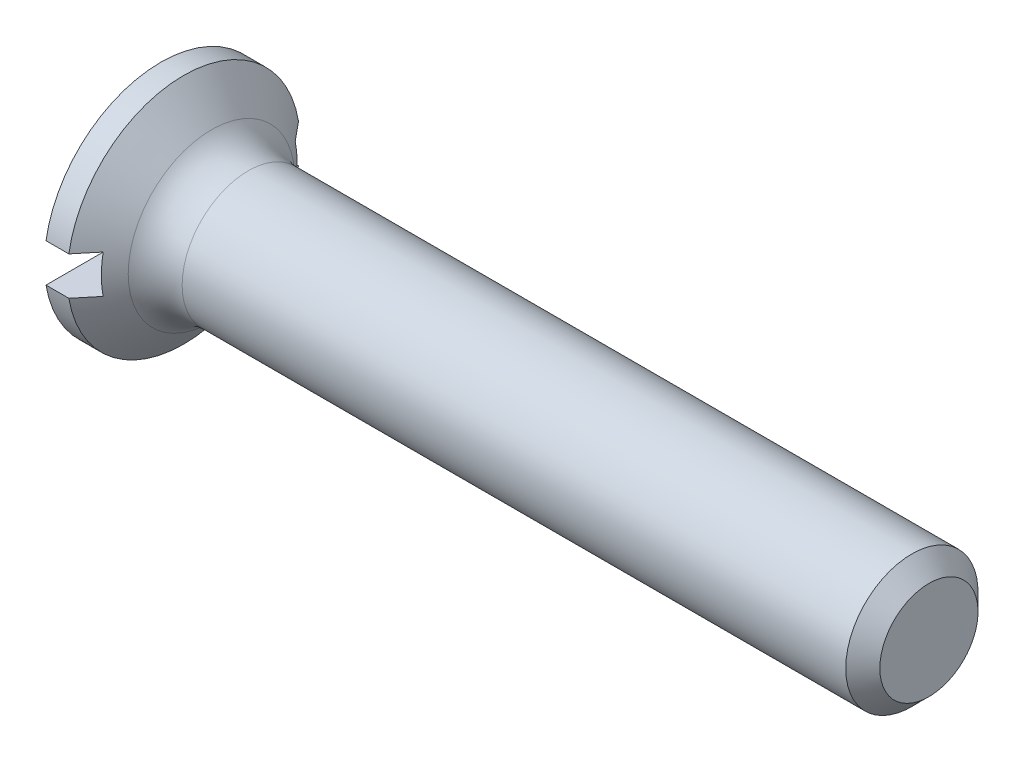
ISO-10303-21;
HEADER;
FILE_DESCRIPTION(('STEP AP214'),'2;1');
FILE_NAME('part.step','',(''),(''),'','','');
FILE_SCHEMA(('AUTOMOTIVE_DESIGN { 1 0 10303 214 1 1 1 1 }'));
ENDSEC;
DATA;
#1=APPLICATION_CONTEXT('core data for automotive mechanical design processes');
#2=APPLICATION_PROTOCOL_DEFINITION('international standard','automotive_design',2000,#1);
#3=PRODUCT_CONTEXT('',#1,'mechanical');
#4=PRODUCT('Part','Part','',(#3));
#5=PRODUCT_RELATED_PRODUCT_CATEGORY('part','',(#4));
#6=PRODUCT_DEFINITION_FORMATION('','',#4);
#7=PRODUCT_DEFINITION_CONTEXT('part definition',#1,'design');
#8=PRODUCT_DEFINITION('design','',#6,#7);
#9=PRODUCT_DEFINITION_SHAPE('','',#8);
#10=(LENGTH_UNIT() NAMED_UNIT(*) SI_UNIT(.MILLI.,.METRE.));
#11=(NAMED_UNIT(*) PLANE_ANGLE_UNIT() SI_UNIT($,.RADIAN.));
#12=(NAMED_UNIT(*) SI_UNIT($,.STERADIAN.) SOLID_ANGLE_UNIT());
#13=UNCERTAINTY_MEASURE_WITH_UNIT(LENGTH_MEASURE(1.E-05),#10,'distance_accuracy_value','');
#14=(GEOMETRIC_REPRESENTATION_CONTEXT(3) GLOBAL_UNCERTAINTY_ASSIGNED_CONTEXT((#13)) GLOBAL_UNIT_ASSIGNED_CONTEXT((#10,
#11,#12)) REPRESENTATION_CONTEXT('',''));
#15=CARTESIAN_POINT('',(0.,0.,0.));
#16=DIRECTION('',(0.,0.,1.));
#17=DIRECTION('',(1.,0.,0.));
#18=AXIS2_PLACEMENT_3D('',#15,#16,#17);
#19=CARTESIAN_POINT('',(-25.4,0.,0.));
#20=DIRECTION('',(-1.,0.,0.));
#21=DIRECTION('',(0.,0.,1.));
#22=AXIS2_PLACEMENT_3D('',#19,#20,#21);
#23=CYLINDRICAL_SURFACE('',#22,1.2319);
#24=DIRECTION('',(-1.,0.,0.));
#25=VECTOR('',#24,1.);
#26=CARTESIAN_POINT('',(-25.4,0.2032,-1.21502566639557));
#27=LINE('',#26,#25);
#28=CARTESIAN_POINT('',(0.,0.2032,-1.21502566639557));
#29=VERTEX_POINT('',#28);
#30=CARTESIAN_POINT('',(0.241904032672099,0.2032,-1.21502566639557));
#31=VERTEX_POINT('',#30);
#32=EDGE_CURVE('E55',#29,#31,#27,.F.);
#33=ORIENTED_EDGE('',*,*,#32,.F.);
#34=CARTESIAN_POINT('',(0.,0.,0.));
#35=DIRECTION('',(-1.,0.,0.));
#36=DIRECTION('',(0.,0.,1.));
#37=AXIS2_PLACEMENT_3D('',#34,#35,#36);
#38=CIRCLE('',#37,1.2319);
#39=CARTESIAN_POINT('',(0.,0.2032,1.21502566639557));
#40=VERTEX_POINT('',#39);
#41=EDGE_CURVE('E103',#40,#29,#38,.T.);
#42=ORIENTED_EDGE('',*,*,#41,.F.);
#43=DIRECTION('',(-1.,0.,0.));
#44=VECTOR('',#43,1.);
#45=CARTESIAN_POINT('',(-25.4,0.2032,1.21502566639557));
#46=LINE('',#45,#44);
#47=CARTESIAN_POINT('',(0.241904032672099,0.2032,1.21502566639557));
#48=VERTEX_POINT('',#47);
#49=EDGE_CURVE('E139',#48,#40,#46,.T.);
#50=ORIENTED_EDGE('',*,*,#49,.F.);
#51=CARTESIAN_POINT('',(0.241904032672099,0.,0.));
#52=DIRECTION('',(-1.,0.,0.));
#53=DIRECTION('',(0.,0.,1.));
#54=AXIS2_PLACEMENT_3D('',#51,#52,#53);
#55=CIRCLE('',#54,1.2319);
#56=EDGE_CURVE('E91',#48,#31,#55,.T.);
#57=ORIENTED_EDGE('',*,*,#56,.T.);
#58=EDGE_LOOP('',(#33,#42,#50,#57));
#59=FACE_BOUND('',#58,.T.);
#60=ADVANCED_FACE('F32',(#59),#23,.T.);
#61=CARTESIAN_POINT('',(0.,0.,0.));
#62=DIRECTION('',(-1.,0.,0.));
#63=DIRECTION('',(0.,0.,1.));
#64=AXIS2_PLACEMENT_3D('',#61,#62,#63);
#65=PLANE('',#64);
#66=DIRECTION('',(0.,0.,-1.));
#67=VECTOR('',#66,1.);
#68=CARTESIAN_POINT('',(0.,0.2032,0.));
#69=LINE('',#68,#67);
#70=EDGE_CURVE('E90',#40,#29,#69,.T.);
#71=ORIENTED_EDGE('',*,*,#70,.F.);
#72=ORIENTED_EDGE('',*,*,#41,.T.);
#73=EDGE_LOOP('',(#71,#72));
#74=FACE_BOUND('',#73,.T.);
#75=ADVANCED_FACE('F166',(#74),#65,.T.);
#76=CARTESIAN_POINT('',(0.241904032672099,0.,0.));
#77=DIRECTION('',(-1.,0.,0.));
#78=DIRECTION('',(0.,0.,1.));
#79=AXIS2_PLACEMENT_3D('',#76,#77,#78);
#80=CONICAL_SURFACE('',#79,1.2319,0.872664625997167);
#81=CARTESIAN_POINT('',(0.536147832648761,0.,0.));
#82=DIRECTION('',(-1.,0.,0.));
#83=DIRECTION('',(0.,0.,1.));
#84=AXIS2_PLACEMENT_3D('',#81,#82,#83);
#85=CIRCLE('',#84,0.881233894279239);
#86=CARTESIAN_POINT('',(0.536147832648761,0.,0.881233894279239));
#87=VERTEX_POINT('',#86);
#88=EDGE_CURVE('E40',#87,#87,#85,.T.);
#89=ORIENTED_EDGE('',*,*,#88,.T.);
#90=EDGE_LOOP('',(#89));
#91=FACE_BOUND('',#90,.T.);
#92=CARTESIAN_POINT('',(-1.00782435907165,0.2032,-2.71367111566613));
#93=CARTESIAN_POINT('',(-0.929345538245219,0.2032,-2.61987981864011));
#94=CARTESIAN_POINT('',(-0.850878149678751,0.2032,-2.52607894830378));
#95=CARTESIAN_POINT('',(-0.693972348673675,0.2032,-2.33843560288618));
#96=CARTESIAN_POINT('',(-0.615533940325913,0.2032,-2.24459312438437));
#97=CARTESIAN_POINT('',(-0.4585421996724,0.2032,-2.0566644851528));
#98=CARTESIAN_POINT('',(-0.379988978750332,0.2032,-1.96257823135071));
#99=CARTESIAN_POINT('',(-0.222971571741094,0.2032,-1.77434862722936));
#100=CARTESIAN_POINT('',(-0.144507376983145,0.2032,-1.6802052841431));
#101=CARTESIAN_POINT('',(0.019941782022011,0.2032,-1.48262378116519));
#102=CARTESIAN_POINT('',(0.105913732788352,0.2032,-1.37917477910013));
#103=CARTESIAN_POINT('',(0.234664323415571,0.2032,-1.22379899223182));
#104=CARTESIAN_POINT('',(0.277554069737319,0.2032,-1.17196431983249));
#105=CARTESIAN_POINT('',(0.363220400399147,0.2032,-1.06820532545848));
#106=CARTESIAN_POINT('',(0.405996989567289,0.2032,-1.01628100747018));
#107=CARTESIAN_POINT('',(0.491314287180181,0.2032,-0.912372391430747));
#108=CARTESIAN_POINT('',(0.53385525739435,0.2032,-0.860388308812528));
#109=CARTESIAN_POINT('',(0.61865771304137,0.2032,-0.756178957553183));
#110=CARTESIAN_POINT('',(0.66091915230768,0.2032,-0.703953651377461));
#111=CARTESIAN_POINT('',(0.744906600301378,0.2032,-0.599125464082437));
#112=CARTESIAN_POINT('',(0.786632936421943,0.2032,-0.546522847876606));
#113=CARTESIAN_POINT('',(0.848356817058193,0.2032,-0.466957105143394));
#114=CARTESIAN_POINT('',(0.868784545336341,0.2032,-0.440328431168231));
#115=CARTESIAN_POINT('',(0.909166683479221,0.2032,-0.386715536202446));
#116=CARTESIAN_POINT('',(0.929121145587176,0.2032,-0.359731354972148));
#117=CARTESIAN_POINT('',(0.958698601979337,0.2032,-0.318413697313177));
#118=CARTESIAN_POINT('',(0.968631422004369,0.2032,-0.304302692995149));
#119=CARTESIAN_POINT('',(0.988181454657596,0.2032,-0.275857917164164));
#120=CARTESIAN_POINT('',(0.997798596868459,0.2032,-0.26152409698505));
#121=CARTESIAN_POINT('',(1.01656529083579,0.2032,-0.232565963588045));
#122=CARTESIAN_POINT('',(1.02571518015246,0.2032,-0.217941870991677));
#123=CARTESIAN_POINT('',(1.04331174562182,0.2032,-0.188278981571099));
#124=CARTESIAN_POINT('',(1.05175872112917,0.2032,-0.173240364953318));
#125=CARTESIAN_POINT('',(1.06795047568891,0.2032,-0.141799903926084));
#126=CARTESIAN_POINT('',(1.07563762172078,0.2032,-0.125367634141238));
#127=CARTESIAN_POINT('',(1.08894068864377,0.2032,-0.0916962605802587));
#128=CARTESIAN_POINT('',(1.09456356514468,0.2032,-0.0744600910467164));
#129=CARTESIAN_POINT('',(1.10172700088508,0.2032,-0.0427243610025343));
#130=CARTESIAN_POINT('',(1.10385882434315,0.2032,-0.0283662816460351));
#131=CARTESIAN_POINT('',(1.10551088273313,0.2032,0.000478604409386819));
#132=CARTESIAN_POINT('',(1.10503698825526,0.2032,0.0149650483895169));
#133=CARTESIAN_POINT('',(1.10117123109375,0.2032,0.0472851499006242));
#134=CARTESIAN_POINT('',(1.0970645255231,0.2032,0.0650279810446476));
#135=CARTESIAN_POINT('',(1.08614915695338,0.2032,0.09973023943129));
#136=CARTESIAN_POINT('',(1.07932057763283,0.2032,0.11668283972175));
#137=CARTESIAN_POINT('',(1.06455917248918,0.2032,0.148753893322175));
#138=CARTESIAN_POINT('',(1.0567261640748,0.2032,0.163920089063489));
#139=CARTESIAN_POINT('',(1.04017648702791,0.2032,0.193768041932893));
#140=CARTESIAN_POINT('',(1.03145917719994,0.2032,0.208449437165815));
#141=CARTESIAN_POINT('',(1.00443164386028,0.2032,0.252050791767615));
#142=CARTESIAN_POINT('',(0.985287604754215,0.2032,0.280447383229794));
#143=CARTESIAN_POINT('',(0.945893189661644,0.2032,0.336638477196391));
#144=CARTESIAN_POINT('',(0.925638043901802,0.2032,0.364429529276655));
#145=CARTESIAN_POINT('',(0.884586895712755,0.2032,0.419531580280406));
#146=CARTESIAN_POINT('',(0.86379193116006,0.2032,0.446843352456371));
#147=CARTESIAN_POINT('',(0.80148620791885,0.2032,0.527643203370981));
#148=CARTESIAN_POINT('',(0.759495425637665,0.2032,0.580758664827904));
#149=CARTESIAN_POINT('',(0.674953180762145,0.2032,0.686543948310977));
#150=CARTESIAN_POINT('',(0.632401676800261,0.2032,0.73921373698131));
#151=CARTESIAN_POINT('',(0.546956321107778,0.2032,0.844344960682826));
#152=CARTESIAN_POINT('',(0.504062222524386,0.2032,0.896806195100943));
#153=CARTESIAN_POINT('',(0.418093944790176,0.2032,1.00157776020191));
#154=CARTESIAN_POINT('',(0.375019771492253,0.2032,1.0538880956974));
#155=CARTESIAN_POINT('',(0.246067263806448,0.2032,1.21014394516107));
#156=CARTESIAN_POINT('',(0.160020447946093,0.2032,1.31395036861084));
#157=CARTESIAN_POINT('',(-0.0122628259546196,0.2032,1.52136132042365));
#158=CARTESIAN_POINT('',(-0.0984992309207124,0.2032,1.62496589295656));
#159=CARTESIAN_POINT('',(-0.253139459037574,0.2032,1.81052778653514));
#160=CARTESIAN_POINT('',(-0.321520462612275,0.2032,1.89250412161468));
#161=CARTESIAN_POINT('',(-0.458339630081111,0.2032,2.0564198788482));
#162=CARTESIAN_POINT('',(-0.526777798006287,0.2032,2.13835929763644));
#163=CARTESIAN_POINT('',(-0.663971310727151,0.2032,2.3025435760581));
#164=CARTESIAN_POINT('',(-0.732726805400999,0.2032,2.38478831044508));
#165=CARTESIAN_POINT('',(-0.870259936791915,0.2032,2.54924828889879));
#166=CARTESIAN_POINT('',(-0.939037571346054,0.2032,2.63146353477424));
#167=CARTESIAN_POINT('',(-1.00782435907165,0.2032,2.71367111566613));
#168=B_SPLINE_CURVE_WITH_KNOTS('',3,(#92,#93,#94,#95,#96,#97,#98,#99,#100,#101,#102,#103,#104,
#105,#106,#107,#108,#109,#110,#111,#112,#113,#114,#115,#116,#117,#118,#119,#120,#121,#122,#123,
#124,#125,#126,#127,#128,#129,#130,#131,#132,#133,#134,#135,#136,#137,#138,#139,#140,#141,#142,
#143,#144,#145,#146,#147,#148,#149,#150,#151,#152,#153,#154,#155,#156,#157,#158,#159,#160,#161,
#162,#163,#164,#165,#166,#167),.UNSPECIFIED.,.F.,.F.,(4,2,2,2,2,2,2,2,2,2,2,2,2,2,2,2,2,2,2,2,2,
2,2,2,2,2,2,2,2,2,2,2,2,2,2,2,2,4),(0.,0.36688090653771,0.733801804500971,1.10150475337063,
1.46916813688413,1.87269703960301,2.07453168440646,2.27635757397862,2.47787272519799,
2.67942036626102,2.88083816737873,2.98152060554395,3.08219187728649,3.13395798405056,
3.18573556072264,3.23747518630563,3.28919266319669,3.34354278188672,3.39770804804914,
3.44104865357705,3.48429165432215,3.53858708743109,3.59328732316338,3.64445430007768,
3.69565864635002,3.79833860802503,3.90150037666848,4.00447667132752,4.20759281168413,
4.41072402188643,4.61401789078786,4.81730520270262,5.22180215775768,5.62619749193587,
5.94645473716791,6.26673688374161,6.58833232019936,6.90990250078245),.UNSPECIFIED.);
#169=CARTESIAN_POINT('',(0.4064,0.2032,1.01573543585121));
#170=VERTEX_POINT('',#169);
#171=EDGE_CURVE('E132',#170,#48,#168,.T.);
#172=ORIENTED_EDGE('',*,*,#171,.F.);
#173=CARTESIAN_POINT('',(0.4064,0.,0.));
#174=DIRECTION('',(1.,0.,0.));
#175=DIRECTION('',(0.,0.,-1.));
#176=AXIS2_PLACEMENT_3D('',#173,#174,#175);
#177=CIRCLE('',#176,1.03586133996971);
#178=CARTESIAN_POINT('',(0.4064,-0.2032,1.01573543585121));
#179=VERTEX_POINT('',#178);
#180=EDGE_CURVE('E115',#179,#170,#177,.F.);
#181=ORIENTED_EDGE('',*,*,#180,.F.);
#182=CARTESIAN_POINT('',(-1.00782435907165,-0.2032,2.71367111566613));
#183=CARTESIAN_POINT('',(-0.929345538245219,-0.2032,2.61987981864011));
#184=CARTESIAN_POINT('',(-0.850878149678752,-0.2032,2.52607894830378));
#185=CARTESIAN_POINT('',(-0.693972348673676,-0.2032,2.33843560288618));
#186=CARTESIAN_POINT('',(-0.615533940325913,-0.2032,2.24459312438437));
#187=CARTESIAN_POINT('',(-0.458542199672401,-0.2032,2.0566644851528));
#188=CARTESIAN_POINT('',(-0.379988978750333,-0.2032,1.96257823135071));
#189=CARTESIAN_POINT('',(-0.222971571741096,-0.2032,1.77434862722936));
#190=CARTESIAN_POINT('',(-0.144507376983147,-0.2032,1.68020528414311));
#191=CARTESIAN_POINT('',(0.0199417820220092,-0.2032,1.48262378116519));
#192=CARTESIAN_POINT('',(0.105913732788351,-0.2032,1.37917477910013));
#193=CARTESIAN_POINT('',(0.234664323415569,-0.2032,1.22379899223183));
#194=CARTESIAN_POINT('',(0.277554069737318,-0.2032,1.17196431983249));
#195=CARTESIAN_POINT('',(0.363220400399146,-0.2032,1.06820532545848));
#196=CARTESIAN_POINT('',(0.405996989567288,-0.2032,1.01628100747018));
#197=CARTESIAN_POINT('',(0.49131428718018,-0.2032,0.912372391430748));
#198=CARTESIAN_POINT('',(0.533855257394349,-0.2032,0.860388308812529));
#199=CARTESIAN_POINT('',(0.618657713041369,-0.2032,0.756178957553184));
#200=CARTESIAN_POINT('',(0.660919152307679,-0.2032,0.703953651377462));
#201=CARTESIAN_POINT('',(0.744906600301377,-0.2032,0.599125464082438));
#202=CARTESIAN_POINT('',(0.786632936421943,-0.2032,0.546522847876606));
#203=CARTESIAN_POINT('',(0.848356817058193,-0.2032,0.466957105143394));
#204=CARTESIAN_POINT('',(0.868784545336341,-0.2032,0.440328431168231));
#205=CARTESIAN_POINT('',(0.909166683479221,-0.2032,0.386715536202446));
#206=CARTESIAN_POINT('',(0.929121145587176,-0.2032,0.359731354972148));
#207=CARTESIAN_POINT('',(0.958698601979337,-0.2032,0.318413697313177));
#208=CARTESIAN_POINT('',(0.968631422004369,-0.2032,0.304302692995149));
#209=CARTESIAN_POINT('',(0.988181454657596,-0.2032,0.275857917164164));
#210=CARTESIAN_POINT('',(0.997798596868459,-0.2032,0.26152409698505));
#211=CARTESIAN_POINT('',(1.01656529083579,-0.2032,0.232565963588045));
#212=CARTESIAN_POINT('',(1.02571518015246,-0.2032,0.217941870991677));
#213=CARTESIAN_POINT('',(1.04331174562182,-0.2032,0.188278981571099));
#214=CARTESIAN_POINT('',(1.05175872112917,-0.2032,0.173240364953318));
#215=CARTESIAN_POINT('',(1.06795047568891,-0.2032,0.141799903926084));
#216=CARTESIAN_POINT('',(1.07563762172078,-0.2032,0.125367634141239));
#217=CARTESIAN_POINT('',(1.08894068864377,-0.2032,0.0916962605802587));
#218=CARTESIAN_POINT('',(1.09456356514468,-0.2032,0.0744600910467163));
#219=CARTESIAN_POINT('',(1.10172700088508,-0.2032,0.0427243610025341));
#220=CARTESIAN_POINT('',(1.10385882434315,-0.2032,0.0283662816460349));
#221=CARTESIAN_POINT('',(1.10551088273313,-0.2032,-0.000478604409386973));
#222=CARTESIAN_POINT('',(1.10503698825526,-0.2032,-0.0149650483895171));
#223=CARTESIAN_POINT('',(1.10117123109375,-0.2032,-0.0472851499006244));
#224=CARTESIAN_POINT('',(1.0970645255231,-0.2032,-0.0650279810446479));
#225=CARTESIAN_POINT('',(1.08614915695338,-0.2032,-0.0997302394312903));
#226=CARTESIAN_POINT('',(1.07932057763283,-0.2032,-0.116682839721751));
#227=CARTESIAN_POINT('',(1.06455917248918,-0.2032,-0.148753893322175));
#228=CARTESIAN_POINT('',(1.05672616407479,-0.2032,-0.163920089063489));
#229=CARTESIAN_POINT('',(1.04017648702791,-0.2032,-0.193768041932893));
#230=CARTESIAN_POINT('',(1.03145917719994,-0.2032,-0.208449437165816));
#231=CARTESIAN_POINT('',(1.00443164386028,-0.2032,-0.252050791767616));
#232=CARTESIAN_POINT('',(0.985287604754215,-0.2032,-0.280447383229795));
#233=CARTESIAN_POINT('',(0.945893189661643,-0.2032,-0.336638477196392));
#234=CARTESIAN_POINT('',(0.925638043901802,-0.2032,-0.364429529276656));
#235=CARTESIAN_POINT('',(0.884586895712754,-0.2032,-0.419531580280406));
#236=CARTESIAN_POINT('',(0.863791931160059,-0.2032,-0.446843352456372));
#237=CARTESIAN_POINT('',(0.80148620791885,-0.2032,-0.527643203370981));
#238=CARTESIAN_POINT('',(0.759495425637665,-0.2032,-0.580758664827905));
#239=CARTESIAN_POINT('',(0.674953180762144,-0.2032,-0.686543948310979));
#240=CARTESIAN_POINT('',(0.63240167680026,-0.2032,-0.739213736981311));
#241=CARTESIAN_POINT('',(0.546956321107777,-0.2032,-0.844344960682828));
#242=CARTESIAN_POINT('',(0.504062222524385,-0.2032,-0.896806195100945));
#243=CARTESIAN_POINT('',(0.418093944790175,-0.2032,-1.00157776020192));
#244=CARTESIAN_POINT('',(0.375019771492251,-0.2032,-1.05388809569741));
#245=CARTESIAN_POINT('',(0.246067263806446,-0.2032,-1.21014394516107));
#246=CARTESIAN_POINT('',(0.160020447946092,-0.2032,-1.31395036861084));
#247=CARTESIAN_POINT('',(-0.0122628259546217,-0.2032,-1.52136132042365));
#248=CARTESIAN_POINT('',(-0.0984992309207147,-0.2032,-1.62496589295657));
#249=CARTESIAN_POINT('',(-0.253139459037576,-0.2032,-1.81052778653514));
#250=CARTESIAN_POINT('',(-0.321520462612277,-0.2032,-1.89250412161468));
#251=CARTESIAN_POINT('',(-0.458339630081112,-0.2032,-2.0564198788482));
#252=CARTESIAN_POINT('',(-0.526777798006289,-0.2032,-2.13835929763644));
#253=CARTESIAN_POINT('',(-0.663971310727152,-0.2032,-2.3025435760581));
#254=CARTESIAN_POINT('',(-0.732726805401,-0.2032,-2.38478831044508));
#255=CARTESIAN_POINT('',(-0.870259936791915,-0.2032,-2.54924828889879));
#256=CARTESIAN_POINT('',(-0.939037571346054,-0.2032,-2.63146353477424));
#257=CARTESIAN_POINT('',(-1.00782435907165,-0.2032,-2.71367111566613));
#258=B_SPLINE_CURVE_WITH_KNOTS('',3,(#182,#183,#184,#185,#186,#187,#188,#189,#190,#191,#192,
#193,#194,#195,#196,#197,#198,#199,#200,#201,#202,#203,#204,#205,#206,#207,#208,#209,#210,#211,
#212,#213,#214,#215,#216,#217,#218,#219,#220,#221,#222,#223,#224,#225,#226,#227,#228,#229,#230,
#231,#232,#233,#234,#235,#236,#237,#238,#239,#240,#241,#242,#243,#244,#245,#246,#247,#248,#249,
#250,#251,#252,#253,#254,#255,#256,#257),.UNSPECIFIED.,.F.,.F.,(4,2,2,2,2,2,2,2,2,2,2,2,2,2,2,2,
2,2,2,2,2,2,2,2,2,2,2,2,2,2,2,2,2,2,2,2,2,4),(0.,0.366880906537709,0.73380180450097,
1.10150475337063,1.46916813688413,1.872697039603,2.07453168440645,2.27635757397861,
2.47787272519799,2.67942036626102,2.88083816737873,2.98152060554395,3.08219187728649,
3.13395798405056,3.18573556072264,3.23747518630563,3.28919266319669,3.34354278188672,
3.39770804804914,3.44104865357705,3.48429165432215,3.53858708743109,3.59328732316338,
3.64445430007768,3.69565864635002,3.79833860802503,3.90150037666848,4.00447667132752,
4.20759281168413,4.41072402188643,4.61401789078786,4.81730520270262,5.22180215775768,
5.62619749193587,5.94645473716792,6.26673688374161,6.58833232019936,6.90990250078245),.UNSPECIFIED.);
#259=CARTESIAN_POINT('',(0.241904032672099,-0.2032,1.21502566639557));
#260=VERTEX_POINT('',#259);
#261=EDGE_CURVE('E99',#260,#179,#258,.T.);
#262=ORIENTED_EDGE('',*,*,#261,.F.);
#263=CARTESIAN_POINT('',(0.241904032672099,-0.2032,-1.21502566639557));
#264=VERTEX_POINT('',#263);
#265=EDGE_CURVE('E98',#264,#260,#55,.T.);
#266=ORIENTED_EDGE('',*,*,#265,.F.);
#267=CARTESIAN_POINT('',(0.4064,-0.2032,-1.01573543585121));
#268=VERTEX_POINT('',#267);
#269=EDGE_CURVE('E100',#268,#264,#258,.T.);
#270=ORIENTED_EDGE('',*,*,#269,.F.);
#271=CARTESIAN_POINT('',(0.4064,0.2032,-1.01573543585121));
#272=VERTEX_POINT('',#271);
#273=EDGE_CURVE('E114',#272,#268,#177,.F.);
#274=ORIENTED_EDGE('',*,*,#273,.F.);
#275=EDGE_CURVE('E134',#31,#272,#168,.T.);
#276=ORIENTED_EDGE('',*,*,#275,.F.);
#277=ORIENTED_EDGE('',*,*,#56,.F.);
#278=EDGE_LOOP('',(#172,#181,#262,#266,#270,#274,#276,#277));
#279=FACE_BOUND('',#278,.T.);
#280=ADVANCED_FACE('F137',(#91,#279),#80,.T.);
#281=DIRECTION('',(-1.,0.,0.));
#282=VECTOR('',#281,1.);
#283=CARTESIAN_POINT('',(-25.4,-0.2032,1.21502566639557));
#284=LINE('',#283,#282);
#285=CARTESIAN_POINT('',(0.,-0.2032,1.21502566639557));
#286=VERTEX_POINT('',#285);
#287=EDGE_CURVE('E85',#286,#260,#284,.F.);
#288=ORIENTED_EDGE('',*,*,#287,.F.);
#289=CARTESIAN_POINT('',(0.,-0.2032,-1.21502566639557));
#290=VERTEX_POINT('',#289);
#291=EDGE_CURVE('E96',#290,#286,#38,.T.);
#292=ORIENTED_EDGE('',*,*,#291,.F.);
#293=DIRECTION('',(-1.,0.,0.));
#294=VECTOR('',#293,1.);
#295=CARTESIAN_POINT('',(-25.4,-0.2032,-1.21502566639557));
#296=LINE('',#295,#294);
#297=EDGE_CURVE('E47',#264,#290,#296,.T.);
#298=ORIENTED_EDGE('',*,*,#297,.F.);
#299=ORIENTED_EDGE('',*,*,#265,.T.);
#300=EDGE_LOOP('',(#288,#292,#298,#299));
#301=FACE_BOUND('',#300,.T.);
#302=ADVANCED_FACE('F95',(#301),#23,.T.);
#303=DIRECTION('',(0.,0.,1.));
#304=VECTOR('',#303,1.);
#305=CARTESIAN_POINT('',(0.,-0.2032,0.));
#306=LINE('',#305,#304);
#307=EDGE_CURVE('E82',#290,#286,#306,.T.);
#308=ORIENTED_EDGE('',*,*,#307,.F.);
#309=ORIENTED_EDGE('',*,*,#291,.T.);
#310=EDGE_LOOP('',(#308,#309));
#311=FACE_BOUND('',#310,.T.);
#312=ADVANCED_FACE('F102',(#311),#65,.T.);
#313=CARTESIAN_POINT('',(8.128,0.51943,0.));
#314=DIRECTION('',(1.,0.,0.));
#315=DIRECTION('',(0.,0.,-1.));
#316=AXIS2_PLACEMENT_3D('',#313,#314,#315);
#317=PLANE('',#316);
#318=CARTESIAN_POINT('',(8.128,0.,0.));
#319=DIRECTION('',(-1.,0.,0.));
#320=DIRECTION('',(0.,0.,1.));
#321=AXIS2_PLACEMENT_3D('',#318,#319,#320);
#322=CIRCLE('',#321,0.51943);
#323=CARTESIAN_POINT('',(8.128,0.,0.51943));
#324=VERTEX_POINT('',#323);
#325=EDGE_CURVE('E104',#324,#324,#322,.T.);
#326=ORIENTED_EDGE('',*,*,#325,.F.);
#327=EDGE_LOOP('',(#326));
#328=FACE_BOUND('',#327,.T.);
#329=ADVANCED_FACE('F154',(#328),#317,.T.);
#330=CARTESIAN_POINT('',(7.94766,0.,0.));
#331=DIRECTION('',(-1.,0.,0.));
#332=DIRECTION('',(0.,0.,1.));
#333=AXIS2_PLACEMENT_3D('',#330,#331,#332);
#334=CONICAL_SURFACE('',#333,0.69977,0.785398163397446);
#335=ORIENTED_EDGE('',*,*,#325,.T.);
#336=EDGE_LOOP('',(#335));
#337=FACE_BOUND('',#336,.T.);
#338=CARTESIAN_POINT('',(7.94766,0.,0.));
#339=DIRECTION('',(-1.,0.,0.));
#340=DIRECTION('',(0.,0.,1.));
#341=AXIS2_PLACEMENT_3D('',#338,#339,#340);
#342=CIRCLE('',#341,0.69977);
#343=CARTESIAN_POINT('',(7.94766,0.,0.69977));
#344=VERTEX_POINT('',#343);
#345=EDGE_CURVE('E108',#344,#344,#342,.T.);
#346=ORIENTED_EDGE('',*,*,#345,.F.);
#347=EDGE_LOOP('',(#346));
#348=FACE_BOUND('',#347,.T.);
#349=ADVANCED_FACE('F152',(#337,#348),#334,.T.);
#350=CARTESIAN_POINT('',(-25.4,0.,0.));
#351=DIRECTION('',(-1.,0.,0.));
#352=DIRECTION('',(0.,0.,1.));
#353=AXIS2_PLACEMENT_3D('',#350,#351,#352);
#354=CYLINDRICAL_SURFACE('',#353,0.69977);
#355=CARTESIAN_POINT('',(0.925298409753202,0.,0.));
#356=DIRECTION('',(-1.,0.,0.));
#357=DIRECTION('',(0.,0.,1.));
#358=AXIS2_PLACEMENT_3D('',#355,#356,#357);
#359=CIRCLE('',#358,0.69977);
#360=CARTESIAN_POINT('',(0.925298409753202,0.,0.69977));
#361=VERTEX_POINT('',#360);
#362=EDGE_CURVE('E11',#361,#361,#359,.F.);
#363=ORIENTED_EDGE('',*,*,#362,.T.);
#364=EDGE_LOOP('',(#363));
#365=FACE_BOUND('',#364,.T.);
#366=ORIENTED_EDGE('',*,*,#345,.T.);
#367=EDGE_LOOP('',(#366));
#368=FACE_BOUND('',#367,.T.);
#369=ADVANCED_FACE('F150',(#365,#368),#354,.T.);
#370=CARTESIAN_POINT('',(0.4064,0.2032,1.2319));
#371=DIRECTION('',(0.,1.,0.));
#372=DIRECTION('',(0.,0.,1.));
#373=AXIS2_PLACEMENT_3D('',#370,#371,#372);
#374=PLANE('',#373);
#375=ORIENTED_EDGE('',*,*,#275,.T.);
#376=DIRECTION('',(0.,0.,-1.));
#377=VECTOR('',#376,1.);
#378=CARTESIAN_POINT('',(0.4064,0.2032,1.2319));
#379=LINE('',#378,#377);
#380=EDGE_CURVE('E125',#170,#272,#379,.T.);
#381=ORIENTED_EDGE('',*,*,#380,.F.);
#382=ORIENTED_EDGE('',*,*,#171,.T.);
#383=ORIENTED_EDGE('',*,*,#49,.T.);
#384=ORIENTED_EDGE('',*,*,#70,.T.);
#385=ORIENTED_EDGE('',*,*,#32,.T.);
#386=EDGE_LOOP('',(#375,#381,#382,#383,#384,#385));
#387=FACE_BOUND('',#386,.T.);
#388=ADVANCED_FACE('F131',(#387),#374,.F.);
#389=CARTESIAN_POINT('',(0.4064,-0.2032,-1.2319));
#390=DIRECTION('',(0.,-1.,0.));
#391=DIRECTION('',(0.,0.,-1.));
#392=AXIS2_PLACEMENT_3D('',#389,#390,#391);
#393=PLANE('',#392);
#394=ORIENTED_EDGE('',*,*,#261,.T.);
#395=DIRECTION('',(0.,0.,1.));
#396=VECTOR('',#395,1.);
#397=CARTESIAN_POINT('',(0.4064,-0.2032,-1.2319));
#398=LINE('',#397,#396);
#399=EDGE_CURVE('E128',#268,#179,#398,.T.);
#400=ORIENTED_EDGE('',*,*,#399,.F.);
#401=ORIENTED_EDGE('',*,*,#269,.T.);
#402=ORIENTED_EDGE('',*,*,#297,.T.);
#403=ORIENTED_EDGE('',*,*,#307,.T.);
#404=ORIENTED_EDGE('',*,*,#287,.T.);
#405=EDGE_LOOP('',(#394,#400,#401,#402,#403,#404));
#406=FACE_BOUND('',#405,.T.);
#407=ADVANCED_FACE('F84',(#406),#393,.F.);
#408=CARTESIAN_POINT('',(0.4064,-0.2032,-1.2319));
#409=DIRECTION('',(1.,0.,0.));
#410=DIRECTION('',(0.,0.,-1.));
#411=AXIS2_PLACEMENT_3D('',#408,#409,#410);
#412=PLANE('',#411);
#413=ORIENTED_EDGE('',*,*,#180,.T.);
#414=ORIENTED_EDGE('',*,*,#380,.T.);
#415=ORIENTED_EDGE('',*,*,#273,.T.);
#416=ORIENTED_EDGE('',*,*,#399,.T.);
#417=EDGE_LOOP('',(#413,#414,#415,#416));
#418=FACE_BOUND('',#417,.T.);
#419=ADVANCED_FACE('F124',(#418),#412,.F.);
#420=CARTESIAN_POINT('',(0.925298409753202,0.,0.));
#421=DIRECTION('',(-1.,0.,0.));
#422=DIRECTION('',(0.,0.,1.));
#423=AXIS2_PLACEMENT_3D('',#420,#421,#422);
#424=TOROIDAL_SURFACE('',#423,1.20777,0.508);
#425=ORIENTED_EDGE('',*,*,#362,.F.);
#426=EDGE_LOOP('',(#425));
#427=FACE_BOUND('',#426,.T.);
#428=ORIENTED_EDGE('',*,*,#88,.F.);
#429=EDGE_LOOP('',(#428));
#430=FACE_BOUND('',#429,.T.);
#431=ADVANCED_FACE('F34',(#427,#430),#424,.F.);
#432=CLOSED_SHELL('',(#60,#75,#280,#302,#312,#329,#349,#369,#388,#407,#419,#431));
#433=MANIFOLD_SOLID_BREP('B2',#432);
#434=ADVANCED_BREP_SHAPE_REPRESENTATION('',(#18,#433),#14);
#435=SHAPE_DEFINITION_REPRESENTATION(#9,#434);
ENDSEC;
END-ISO-10303-21;
